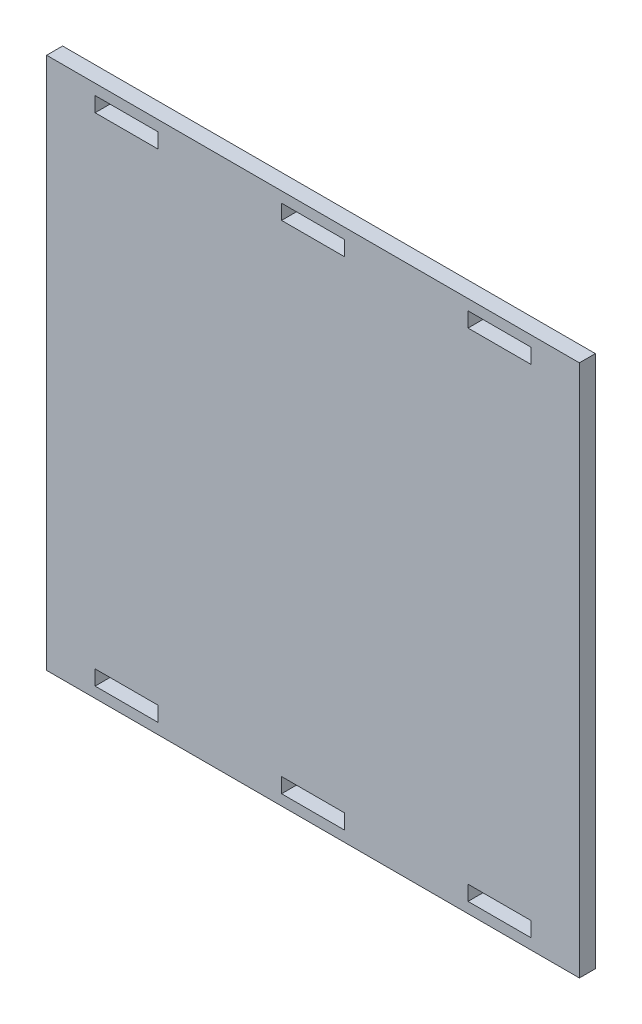
ISO-10303-21;
HEADER;
FILE_DESCRIPTION(('STEP AP214'),'2;1');
FILE_NAME('part.step','',(''),(''),'','','');
FILE_SCHEMA(('AUTOMOTIVE_DESIGN { 1 0 10303 214 1 1 1 1 }'));
ENDSEC;
DATA;
#1=APPLICATION_CONTEXT('core data for automotive mechanical design processes');
#2=APPLICATION_PROTOCOL_DEFINITION('international standard','automotive_design',2000,#1);
#3=PRODUCT_CONTEXT('',#1,'mechanical');
#4=PRODUCT('Part','Part','',(#3));
#5=PRODUCT_RELATED_PRODUCT_CATEGORY('part','',(#4));
#6=PRODUCT_DEFINITION_FORMATION('','',#4);
#7=PRODUCT_DEFINITION_CONTEXT('part definition',#1,'design');
#8=PRODUCT_DEFINITION('design','',#6,#7);
#9=PRODUCT_DEFINITION_SHAPE('','',#8);
#10=(LENGTH_UNIT() NAMED_UNIT(*) SI_UNIT(.MILLI.,.METRE.));
#11=(NAMED_UNIT(*) PLANE_ANGLE_UNIT() SI_UNIT($,.RADIAN.));
#12=(NAMED_UNIT(*) SI_UNIT($,.STERADIAN.) SOLID_ANGLE_UNIT());
#13=UNCERTAINTY_MEASURE_WITH_UNIT(LENGTH_MEASURE(1.E-05),#10,'distance_accuracy_value','');
#14=(GEOMETRIC_REPRESENTATION_CONTEXT(3) GLOBAL_UNCERTAINTY_ASSIGNED_CONTEXT((#13)) GLOBAL_UNIT_ASSIGNED_CONTEXT((#10,
#11,#12)) REPRESENTATION_CONTEXT('',''));
#15=CARTESIAN_POINT('',(0.,0.,0.));
#16=DIRECTION('',(0.,0.,1.));
#17=DIRECTION('',(1.,0.,0.));
#18=AXIS2_PLACEMENT_3D('',#15,#16,#17);
#19=CARTESIAN_POINT('',(0.,0.,-3.));
#20=DIRECTION('',(-1.,0.,0.));
#21=DIRECTION('',(0.,0.,1.));
#22=AXIS2_PLACEMENT_3D('',#19,#20,#21);
#23=PLANE('',#22);
#24=DIRECTION('',(0.,-1.,0.));
#25=VECTOR('',#24,1.);
#26=CARTESIAN_POINT('',(0.,0.,0.));
#27=LINE('',#26,#25);
#28=CARTESIAN_POINT('',(0.,100.,0.));
#29=VERTEX_POINT('',#28);
#30=CARTESIAN_POINT('',(0.,0.,0.));
#31=VERTEX_POINT('',#30);
#32=EDGE_CURVE('E410',#29,#31,#27,.T.);
#33=ORIENTED_EDGE('',*,*,#32,.F.);
#34=DIRECTION('',(0.,0.,1.));
#35=VECTOR('',#34,1.);
#36=CARTESIAN_POINT('',(0.,100.,-3.));
#37=LINE('',#36,#35);
#38=CARTESIAN_POINT('',(0.,100.,-3.));
#39=VERTEX_POINT('',#38);
#40=EDGE_CURVE('E11',#39,#29,#37,.T.);
#41=ORIENTED_EDGE('',*,*,#40,.F.);
#42=DIRECTION('',(0.,-1.,0.));
#43=VECTOR('',#42,1.);
#44=CARTESIAN_POINT('',(0.,0.,-3.));
#45=LINE('',#44,#43);
#46=CARTESIAN_POINT('',(0.,0.,-3.));
#47=VERTEX_POINT('',#46);
#48=EDGE_CURVE('E417',#39,#47,#45,.T.);
#49=ORIENTED_EDGE('',*,*,#48,.T.);
#50=DIRECTION('',(0.,0.,1.));
#51=VECTOR('',#50,1.);
#52=CARTESIAN_POINT('',(0.,0.,-3.));
#53=LINE('',#52,#51);
#54=EDGE_CURVE('E38',#47,#31,#53,.T.);
#55=ORIENTED_EDGE('',*,*,#54,.T.);
#56=EDGE_LOOP('',(#33,#41,#49,#55));
#57=FACE_BOUND('',#56,.T.);
#58=ADVANCED_FACE('F35',(#57),#23,.T.);
#59=CARTESIAN_POINT('',(0.,100.,-3.));
#60=DIRECTION('',(0.,1.,0.));
#61=DIRECTION('',(0.,0.,1.));
#62=AXIS2_PLACEMENT_3D('',#59,#60,#61);
#63=PLANE('',#62);
#64=DIRECTION('',(-1.,0.,0.));
#65=VECTOR('',#64,1.);
#66=CARTESIAN_POINT('',(0.,100.,0.));
#67=LINE('',#66,#65);
#68=CARTESIAN_POINT('',(100.,100.,0.));
#69=VERTEX_POINT('',#68);
#70=EDGE_CURVE('E421',#69,#29,#67,.T.);
#71=ORIENTED_EDGE('',*,*,#70,.F.);
#72=DIRECTION('',(0.,0.,1.));
#73=VECTOR('',#72,1.);
#74=CARTESIAN_POINT('',(100.,100.,-3.));
#75=LINE('',#74,#73);
#76=CARTESIAN_POINT('',(100.,100.,-3.));
#77=VERTEX_POINT('',#76);
#78=EDGE_CURVE('E43',#77,#69,#75,.T.);
#79=ORIENTED_EDGE('',*,*,#78,.F.);
#80=DIRECTION('',(-1.,0.,0.));
#81=VECTOR('',#80,1.);
#82=CARTESIAN_POINT('',(0.,100.,-3.));
#83=LINE('',#82,#81);
#84=EDGE_CURVE('E427',#77,#39,#83,.T.);
#85=ORIENTED_EDGE('',*,*,#84,.T.);
#86=ORIENTED_EDGE('',*,*,#40,.T.);
#87=EDGE_LOOP('',(#71,#79,#85,#86));
#88=FACE_BOUND('',#87,.T.);
#89=ADVANCED_FACE('F453',(#88),#63,.T.);
#90=CARTESIAN_POINT('',(100.,0.,-3.));
#91=DIRECTION('',(1.,0.,0.));
#92=DIRECTION('',(0.,0.,-1.));
#93=AXIS2_PLACEMENT_3D('',#90,#91,#92);
#94=PLANE('',#93);
#95=DIRECTION('',(0.,1.,0.));
#96=VECTOR('',#95,1.);
#97=CARTESIAN_POINT('',(100.,0.,0.));
#98=LINE('',#97,#96);
#99=CARTESIAN_POINT('',(100.,0.,0.));
#100=VERTEX_POINT('',#99);
#101=EDGE_CURVE('E435',#100,#69,#98,.T.);
#102=ORIENTED_EDGE('',*,*,#101,.F.);
#103=DIRECTION('',(0.,0.,1.));
#104=VECTOR('',#103,1.);
#105=CARTESIAN_POINT('',(100.,0.,-3.));
#106=LINE('',#105,#104);
#107=CARTESIAN_POINT('',(100.,0.,-3.));
#108=VERTEX_POINT('',#107);
#109=EDGE_CURVE('E440',#108,#100,#106,.T.);
#110=ORIENTED_EDGE('',*,*,#109,.F.);
#111=DIRECTION('',(0.,1.,0.));
#112=VECTOR('',#111,1.);
#113=CARTESIAN_POINT('',(100.,0.,-3.));
#114=LINE('',#113,#112);
#115=EDGE_CURVE('E424',#108,#77,#114,.T.);
#116=ORIENTED_EDGE('',*,*,#115,.T.);
#117=ORIENTED_EDGE('',*,*,#78,.T.);
#118=EDGE_LOOP('',(#102,#110,#116,#117));
#119=FACE_BOUND('',#118,.T.);
#120=ADVANCED_FACE('F458',(#119),#94,.T.);
#121=CARTESIAN_POINT('',(0.,0.,-3.));
#122=DIRECTION('',(0.,-1.,0.));
#123=DIRECTION('',(0.,0.,-1.));
#124=AXIS2_PLACEMENT_3D('',#121,#122,#123);
#125=PLANE('',#124);
#126=DIRECTION('',(1.,0.,0.));
#127=VECTOR('',#126,1.);
#128=CARTESIAN_POINT('',(0.,0.,0.));
#129=LINE('',#128,#127);
#130=EDGE_CURVE('E432',#31,#100,#129,.T.);
#131=ORIENTED_EDGE('',*,*,#130,.F.);
#132=ORIENTED_EDGE('',*,*,#54,.F.);
#133=DIRECTION('',(1.,0.,0.));
#134=VECTOR('',#133,1.);
#135=CARTESIAN_POINT('',(0.,0.,-3.));
#136=LINE('',#135,#134);
#137=EDGE_CURVE('E420',#47,#108,#136,.T.);
#138=ORIENTED_EDGE('',*,*,#137,.T.);
#139=ORIENTED_EDGE('',*,*,#109,.T.);
#140=EDGE_LOOP('',(#131,#132,#138,#139));
#141=FACE_BOUND('',#140,.T.);
#142=ADVANCED_FACE('F448',(#141),#125,.T.);
#143=CARTESIAN_POINT('',(0.,0.,-3.));
#144=DIRECTION('',(0.,0.,-1.));
#145=DIRECTION('',(-1.,0.,0.));
#146=AXIS2_PLACEMENT_3D('',#143,#144,#145);
#147=PLANE('',#146);
#148=DIRECTION('',(0.,-1.,0.));
#149=VECTOR('',#148,1.);
#150=CARTESIAN_POINT('',(9.1,95.2,-3.));
#151=LINE('',#150,#149);
#152=CARTESIAN_POINT('',(9.1,98.,-3.));
#153=VERTEX_POINT('',#152);
#154=CARTESIAN_POINT('',(9.1,95.2,-3.));
#155=VERTEX_POINT('',#154);
#156=EDGE_CURVE('E222',#153,#155,#151,.T.);
#157=ORIENTED_EDGE('',*,*,#156,.T.);
#158=DIRECTION('',(1.,0.,0.));
#159=VECTOR('',#158,1.);
#160=CARTESIAN_POINT('',(9.1,95.2,-3.));
#161=LINE('',#160,#159);
#162=CARTESIAN_POINT('',(20.9,95.2,-3.));
#163=VERTEX_POINT('',#162);
#164=EDGE_CURVE('E231',#155,#163,#161,.T.);
#165=ORIENTED_EDGE('',*,*,#164,.T.);
#166=DIRECTION('',(0.,1.,0.));
#167=VECTOR('',#166,1.);
#168=CARTESIAN_POINT('',(20.9,95.2,-3.));
#169=LINE('',#168,#167);
#170=CARTESIAN_POINT('',(20.9,98.,-3.));
#171=VERTEX_POINT('',#170);
#172=EDGE_CURVE('E51',#163,#171,#169,.T.);
#173=ORIENTED_EDGE('',*,*,#172,.T.);
#174=DIRECTION('',(-1.,0.,0.));
#175=VECTOR('',#174,1.);
#176=CARTESIAN_POINT('',(9.1,98.,-3.));
#177=LINE('',#176,#175);
#178=EDGE_CURVE('E228',#171,#153,#177,.T.);
#179=ORIENTED_EDGE('',*,*,#178,.T.);
#180=EDGE_LOOP('',(#157,#165,#173,#179));
#181=FACE_BOUND('',#180,.T.);
#182=DIRECTION('',(0.,-1.,0.));
#183=VECTOR('',#182,1.);
#184=CARTESIAN_POINT('',(44.1,95.2,-3.));
#185=LINE('',#184,#183);
#186=CARTESIAN_POINT('',(44.1,98.,-3.));
#187=VERTEX_POINT('',#186);
#188=CARTESIAN_POINT('',(44.1,95.2,-3.));
#189=VERTEX_POINT('',#188);
#190=EDGE_CURVE('E257',#187,#189,#185,.T.);
#191=ORIENTED_EDGE('',*,*,#190,.T.);
#192=DIRECTION('',(1.,0.,0.));
#193=VECTOR('',#192,1.);
#194=CARTESIAN_POINT('',(44.1,95.2,-3.));
#195=LINE('',#194,#193);
#196=CARTESIAN_POINT('',(55.9,95.2,-3.));
#197=VERTEX_POINT('',#196);
#198=EDGE_CURVE('E260',#189,#197,#195,.T.);
#199=ORIENTED_EDGE('',*,*,#198,.T.);
#200=DIRECTION('',(0.,1.,0.));
#201=VECTOR('',#200,1.);
#202=CARTESIAN_POINT('',(55.9,95.2,-3.));
#203=LINE('',#202,#201);
#204=CARTESIAN_POINT('',(55.9,98.,-3.));
#205=VERTEX_POINT('',#204);
#206=EDGE_CURVE('E264',#197,#205,#203,.T.);
#207=ORIENTED_EDGE('',*,*,#206,.T.);
#208=DIRECTION('',(-1.,0.,0.));
#209=VECTOR('',#208,1.);
#210=CARTESIAN_POINT('',(44.1,98.,-3.));
#211=LINE('',#210,#209);
#212=EDGE_CURVE('E267',#205,#187,#211,.T.);
#213=ORIENTED_EDGE('',*,*,#212,.T.);
#214=EDGE_LOOP('',(#191,#199,#207,#213));
#215=FACE_BOUND('',#214,.T.);
#216=DIRECTION('',(1.,0.,0.));
#217=VECTOR('',#216,1.);
#218=CARTESIAN_POINT('',(79.1,2.,-3.));
#219=LINE('',#218,#217);
#220=CARTESIAN_POINT('',(79.1,2.,-3.));
#221=VERTEX_POINT('',#220);
#222=CARTESIAN_POINT('',(90.9,2.,-3.));
#223=VERTEX_POINT('',#222);
#224=EDGE_CURVE('E289',#221,#223,#219,.T.);
#225=ORIENTED_EDGE('',*,*,#224,.T.);
#226=DIRECTION('',(0.,1.,0.));
#227=VECTOR('',#226,1.);
#228=CARTESIAN_POINT('',(90.9,4.8,-3.));
#229=LINE('',#228,#227);
#230=CARTESIAN_POINT('',(90.9,4.8,-3.));
#231=VERTEX_POINT('',#230);
#232=EDGE_CURVE('E292',#223,#231,#229,.T.);
#233=ORIENTED_EDGE('',*,*,#232,.T.);
#234=DIRECTION('',(-1.,0.,0.));
#235=VECTOR('',#234,1.);
#236=CARTESIAN_POINT('',(79.1,4.8,-3.));
#237=LINE('',#236,#235);
#238=CARTESIAN_POINT('',(79.1,4.8,-3.));
#239=VERTEX_POINT('',#238);
#240=EDGE_CURVE('E296',#231,#239,#237,.T.);
#241=ORIENTED_EDGE('',*,*,#240,.T.);
#242=DIRECTION('',(0.,-1.,0.));
#243=VECTOR('',#242,1.);
#244=CARTESIAN_POINT('',(79.1,4.8,-3.));
#245=LINE('',#244,#243);
#246=EDGE_CURVE('E299',#239,#221,#245,.T.);
#247=ORIENTED_EDGE('',*,*,#246,.T.);
#248=EDGE_LOOP('',(#225,#233,#241,#247));
#249=FACE_BOUND('',#248,.T.);
#250=DIRECTION('',(1.,0.,0.));
#251=VECTOR('',#250,1.);
#252=CARTESIAN_POINT('',(44.1,2.,-3.));
#253=LINE('',#252,#251);
#254=CARTESIAN_POINT('',(44.1,2.,-3.));
#255=VERTEX_POINT('',#254);
#256=CARTESIAN_POINT('',(55.9,2.,-3.));
#257=VERTEX_POINT('',#256);
#258=EDGE_CURVE('E321',#255,#257,#253,.T.);
#259=ORIENTED_EDGE('',*,*,#258,.T.);
#260=DIRECTION('',(0.,1.,0.));
#261=VECTOR('',#260,1.);
#262=CARTESIAN_POINT('',(55.9,4.8,-3.));
#263=LINE('',#262,#261);
#264=CARTESIAN_POINT('',(55.9,4.8,-3.));
#265=VERTEX_POINT('',#264);
#266=EDGE_CURVE('E324',#257,#265,#263,.T.);
#267=ORIENTED_EDGE('',*,*,#266,.T.);
#268=DIRECTION('',(-1.,0.,0.));
#269=VECTOR('',#268,1.);
#270=CARTESIAN_POINT('',(44.1,4.8,-3.));
#271=LINE('',#270,#269);
#272=CARTESIAN_POINT('',(44.1,4.8,-3.));
#273=VERTEX_POINT('',#272);
#274=EDGE_CURVE('E328',#265,#273,#271,.T.);
#275=ORIENTED_EDGE('',*,*,#274,.T.);
#276=DIRECTION('',(0.,-1.,0.));
#277=VECTOR('',#276,1.);
#278=CARTESIAN_POINT('',(44.1,4.8,-3.));
#279=LINE('',#278,#277);
#280=EDGE_CURVE('E331',#273,#255,#279,.T.);
#281=ORIENTED_EDGE('',*,*,#280,.T.);
#282=EDGE_LOOP('',(#259,#267,#275,#281));
#283=FACE_BOUND('',#282,.T.);
#284=DIRECTION('',(0.,-1.,0.));
#285=VECTOR('',#284,1.);
#286=CARTESIAN_POINT('',(79.1,95.2,-3.));
#287=LINE('',#286,#285);
#288=CARTESIAN_POINT('',(79.1,98.,-3.));
#289=VERTEX_POINT('',#288);
#290=CARTESIAN_POINT('',(79.1,95.2,-3.));
#291=VERTEX_POINT('',#290);
#292=EDGE_CURVE('E353',#289,#291,#287,.T.);
#293=ORIENTED_EDGE('',*,*,#292,.T.);
#294=DIRECTION('',(1.,0.,0.));
#295=VECTOR('',#294,1.);
#296=CARTESIAN_POINT('',(79.1,95.2,-3.));
#297=LINE('',#296,#295);
#298=CARTESIAN_POINT('',(90.9,95.2,-3.));
#299=VERTEX_POINT('',#298);
#300=EDGE_CURVE('E356',#291,#299,#297,.T.);
#301=ORIENTED_EDGE('',*,*,#300,.T.);
#302=DIRECTION('',(0.,1.,0.));
#303=VECTOR('',#302,1.);
#304=CARTESIAN_POINT('',(90.9,95.2,-3.));
#305=LINE('',#304,#303);
#306=CARTESIAN_POINT('',(90.9,98.,-3.));
#307=VERTEX_POINT('',#306);
#308=EDGE_CURVE('E360',#299,#307,#305,.T.);
#309=ORIENTED_EDGE('',*,*,#308,.T.);
#310=DIRECTION('',(-1.,0.,0.));
#311=VECTOR('',#310,1.);
#312=CARTESIAN_POINT('',(79.1,98.,-3.));
#313=LINE('',#312,#311);
#314=EDGE_CURVE('E363',#307,#289,#313,.T.);
#315=ORIENTED_EDGE('',*,*,#314,.T.);
#316=EDGE_LOOP('',(#293,#301,#309,#315));
#317=FACE_BOUND('',#316,.T.);
#318=DIRECTION('',(0.,1.,0.));
#319=VECTOR('',#318,1.);
#320=CARTESIAN_POINT('',(20.9,4.8,-3.));
#321=LINE('',#320,#319);
#322=CARTESIAN_POINT('',(20.9,2.,-3.));
#323=VERTEX_POINT('',#322);
#324=CARTESIAN_POINT('',(20.9,4.8,-3.));
#325=VERTEX_POINT('',#324);
#326=EDGE_CURVE('E385',#323,#325,#321,.T.);
#327=ORIENTED_EDGE('',*,*,#326,.T.);
#328=DIRECTION('',(-1.,0.,0.));
#329=VECTOR('',#328,1.);
#330=CARTESIAN_POINT('',(9.1,4.8,-3.));
#331=LINE('',#330,#329);
#332=CARTESIAN_POINT('',(9.1,4.8,-3.));
#333=VERTEX_POINT('',#332);
#334=EDGE_CURVE('E388',#325,#333,#331,.T.);
#335=ORIENTED_EDGE('',*,*,#334,.T.);
#336=DIRECTION('',(0.,-1.,0.));
#337=VECTOR('',#336,1.);
#338=CARTESIAN_POINT('',(9.1,4.8,-3.));
#339=LINE('',#338,#337);
#340=CARTESIAN_POINT('',(9.1,2.,-3.));
#341=VERTEX_POINT('',#340);
#342=EDGE_CURVE('E392',#333,#341,#339,.T.);
#343=ORIENTED_EDGE('',*,*,#342,.T.);
#344=DIRECTION('',(1.,0.,0.));
#345=VECTOR('',#344,1.);
#346=CARTESIAN_POINT('',(9.1,2.,-3.));
#347=LINE('',#346,#345);
#348=EDGE_CURVE('E395',#341,#323,#347,.T.);
#349=ORIENTED_EDGE('',*,*,#348,.T.);
#350=EDGE_LOOP('',(#327,#335,#343,#349));
#351=FACE_BOUND('',#350,.T.);
#352=ORIENTED_EDGE('',*,*,#48,.F.);
#353=ORIENTED_EDGE('',*,*,#84,.F.);
#354=ORIENTED_EDGE('',*,*,#115,.F.);
#355=ORIENTED_EDGE('',*,*,#137,.F.);
#356=EDGE_LOOP('',(#352,#353,#354,#355));
#357=FACE_BOUND('',#356,.T.);
#358=ADVANCED_FACE('F235',(#181,#215,#249,#283,#317,#351,#357),#147,.T.);
#359=CARTESIAN_POINT('',(0.,0.,0.));
#360=DIRECTION('',(0.,0.,-1.));
#361=DIRECTION('',(-1.,0.,0.));
#362=AXIS2_PLACEMENT_3D('',#359,#360,#361);
#363=PLANE('',#362);
#364=DIRECTION('',(1.,0.,0.));
#365=VECTOR('',#364,1.);
#366=CARTESIAN_POINT('',(9.1,95.2,0.));
#367=LINE('',#366,#365);
#368=CARTESIAN_POINT('',(9.1,95.2,0.));
#369=VERTEX_POINT('',#368);
#370=CARTESIAN_POINT('',(20.9,95.2,0.));
#371=VERTEX_POINT('',#370);
#372=EDGE_CURVE('E247',#369,#371,#367,.T.);
#373=ORIENTED_EDGE('',*,*,#372,.F.);
#374=DIRECTION('',(0.,-1.,0.));
#375=VECTOR('',#374,1.);
#376=CARTESIAN_POINT('',(9.1,95.2,0.));
#377=LINE('',#376,#375);
#378=CARTESIAN_POINT('',(9.1,98.,0.));
#379=VERTEX_POINT('',#378);
#380=EDGE_CURVE('E59',#379,#369,#377,.T.);
#381=ORIENTED_EDGE('',*,*,#380,.F.);
#382=DIRECTION('',(-1.,0.,0.));
#383=VECTOR('',#382,1.);
#384=CARTESIAN_POINT('',(9.1,98.,0.));
#385=LINE('',#384,#383);
#386=CARTESIAN_POINT('',(20.9,98.,0.));
#387=VERTEX_POINT('',#386);
#388=EDGE_CURVE('E238',#387,#379,#385,.T.);
#389=ORIENTED_EDGE('',*,*,#388,.F.);
#390=DIRECTION('',(0.,1.,0.));
#391=VECTOR('',#390,1.);
#392=CARTESIAN_POINT('',(20.9,95.2,0.));
#393=LINE('',#392,#391);
#394=EDGE_CURVE('E241',#371,#387,#393,.T.);
#395=ORIENTED_EDGE('',*,*,#394,.F.);
#396=EDGE_LOOP('',(#373,#381,#389,#395));
#397=FACE_BOUND('',#396,.T.);
#398=DIRECTION('',(1.,0.,0.));
#399=VECTOR('',#398,1.);
#400=CARTESIAN_POINT('',(44.1,95.2,0.));
#401=LINE('',#400,#399);
#402=CARTESIAN_POINT('',(44.1,95.2,0.));
#403=VERTEX_POINT('',#402);
#404=CARTESIAN_POINT('',(55.9,95.2,0.));
#405=VERTEX_POINT('',#404);
#406=EDGE_CURVE('E272',#403,#405,#401,.T.);
#407=ORIENTED_EDGE('',*,*,#406,.F.);
#408=DIRECTION('',(0.,-1.,0.));
#409=VECTOR('',#408,1.);
#410=CARTESIAN_POINT('',(44.1,95.2,0.));
#411=LINE('',#410,#409);
#412=CARTESIAN_POINT('',(44.1,98.,0.));
#413=VERTEX_POINT('',#412);
#414=EDGE_CURVE('E253',#413,#403,#411,.T.);
#415=ORIENTED_EDGE('',*,*,#414,.F.);
#416=DIRECTION('',(-1.,0.,0.));
#417=VECTOR('',#416,1.);
#418=CARTESIAN_POINT('',(44.1,98.,0.));
#419=LINE('',#418,#417);
#420=CARTESIAN_POINT('',(55.9,98.,0.));
#421=VERTEX_POINT('',#420);
#422=EDGE_CURVE('E261',#421,#413,#419,.T.);
#423=ORIENTED_EDGE('',*,*,#422,.F.);
#424=DIRECTION('',(0.,1.,0.));
#425=VECTOR('',#424,1.);
#426=CARTESIAN_POINT('',(55.9,95.2,0.));
#427=LINE('',#426,#425);
#428=EDGE_CURVE('E275',#405,#421,#427,.T.);
#429=ORIENTED_EDGE('',*,*,#428,.F.);
#430=EDGE_LOOP('',(#407,#415,#423,#429));
#431=FACE_BOUND('',#430,.T.);
#432=DIRECTION('',(0.,1.,0.));
#433=VECTOR('',#432,1.);
#434=CARTESIAN_POINT('',(90.9,4.8,0.));
#435=LINE('',#434,#433);
#436=CARTESIAN_POINT('',(90.9,2.,0.));
#437=VERTEX_POINT('',#436);
#438=CARTESIAN_POINT('',(90.9,4.8,0.));
#439=VERTEX_POINT('',#438);
#440=EDGE_CURVE('E304',#437,#439,#435,.T.);
#441=ORIENTED_EDGE('',*,*,#440,.F.);
#442=DIRECTION('',(1.,0.,0.));
#443=VECTOR('',#442,1.);
#444=CARTESIAN_POINT('',(79.1,2.,0.));
#445=LINE('',#444,#443);
#446=CARTESIAN_POINT('',(79.1,2.,0.));
#447=VERTEX_POINT('',#446);
#448=EDGE_CURVE('E282',#447,#437,#445,.T.);
#449=ORIENTED_EDGE('',*,*,#448,.F.);
#450=DIRECTION('',(0.,-1.,0.));
#451=VECTOR('',#450,1.);
#452=CARTESIAN_POINT('',(79.1,4.8,0.));
#453=LINE('',#452,#451);
#454=CARTESIAN_POINT('',(79.1,4.8,0.));
#455=VERTEX_POINT('',#454);
#456=EDGE_CURVE('E293',#455,#447,#453,.T.);
#457=ORIENTED_EDGE('',*,*,#456,.F.);
#458=DIRECTION('',(-1.,0.,0.));
#459=VECTOR('',#458,1.);
#460=CARTESIAN_POINT('',(79.1,4.8,0.));
#461=LINE('',#460,#459);
#462=EDGE_CURVE('E307',#439,#455,#461,.T.);
#463=ORIENTED_EDGE('',*,*,#462,.F.);
#464=EDGE_LOOP('',(#441,#449,#457,#463));
#465=FACE_BOUND('',#464,.T.);
#466=DIRECTION('',(0.,1.,0.));
#467=VECTOR('',#466,1.);
#468=CARTESIAN_POINT('',(55.9,4.8,0.));
#469=LINE('',#468,#467);
#470=CARTESIAN_POINT('',(55.9,2.,0.));
#471=VERTEX_POINT('',#470);
#472=CARTESIAN_POINT('',(55.9,4.8,0.));
#473=VERTEX_POINT('',#472);
#474=EDGE_CURVE('E336',#471,#473,#469,.T.);
#475=ORIENTED_EDGE('',*,*,#474,.F.);
#476=DIRECTION('',(1.,0.,0.));
#477=VECTOR('',#476,1.);
#478=CARTESIAN_POINT('',(44.1,2.,0.));
#479=LINE('',#478,#477);
#480=CARTESIAN_POINT('',(44.1,2.,0.));
#481=VERTEX_POINT('',#480);
#482=EDGE_CURVE('E314',#481,#471,#479,.T.);
#483=ORIENTED_EDGE('',*,*,#482,.F.);
#484=DIRECTION('',(0.,-1.,0.));
#485=VECTOR('',#484,1.);
#486=CARTESIAN_POINT('',(44.1,4.8,0.));
#487=LINE('',#486,#485);
#488=CARTESIAN_POINT('',(44.1,4.8,0.));
#489=VERTEX_POINT('',#488);
#490=EDGE_CURVE('E325',#489,#481,#487,.T.);
#491=ORIENTED_EDGE('',*,*,#490,.F.);
#492=DIRECTION('',(-1.,0.,0.));
#493=VECTOR('',#492,1.);
#494=CARTESIAN_POINT('',(44.1,4.8,0.));
#495=LINE('',#494,#493);
#496=EDGE_CURVE('E339',#473,#489,#495,.T.);
#497=ORIENTED_EDGE('',*,*,#496,.F.);
#498=EDGE_LOOP('',(#475,#483,#491,#497));
#499=FACE_BOUND('',#498,.T.);
#500=DIRECTION('',(1.,0.,0.));
#501=VECTOR('',#500,1.);
#502=CARTESIAN_POINT('',(79.1,95.2,0.));
#503=LINE('',#502,#501);
#504=CARTESIAN_POINT('',(79.1,95.2,0.));
#505=VERTEX_POINT('',#504);
#506=CARTESIAN_POINT('',(90.9,95.2,0.));
#507=VERTEX_POINT('',#506);
#508=EDGE_CURVE('E368',#505,#507,#503,.T.);
#509=ORIENTED_EDGE('',*,*,#508,.F.);
#510=DIRECTION('',(0.,-1.,0.));
#511=VECTOR('',#510,1.);
#512=CARTESIAN_POINT('',(79.1,95.2,0.));
#513=LINE('',#512,#511);
#514=CARTESIAN_POINT('',(79.1,98.,0.));
#515=VERTEX_POINT('',#514);
#516=EDGE_CURVE('E346',#515,#505,#513,.T.);
#517=ORIENTED_EDGE('',*,*,#516,.F.);
#518=DIRECTION('',(-1.,0.,0.));
#519=VECTOR('',#518,1.);
#520=CARTESIAN_POINT('',(79.1,98.,0.));
#521=LINE('',#520,#519);
#522=CARTESIAN_POINT('',(90.9,98.,0.));
#523=VERTEX_POINT('',#522);
#524=EDGE_CURVE('E357',#523,#515,#521,.T.);
#525=ORIENTED_EDGE('',*,*,#524,.F.);
#526=DIRECTION('',(0.,1.,0.));
#527=VECTOR('',#526,1.);
#528=CARTESIAN_POINT('',(90.9,95.2,0.));
#529=LINE('',#528,#527);
#530=EDGE_CURVE('E371',#507,#523,#529,.T.);
#531=ORIENTED_EDGE('',*,*,#530,.F.);
#532=EDGE_LOOP('',(#509,#517,#525,#531));
#533=FACE_BOUND('',#532,.T.);
#534=DIRECTION('',(-1.,0.,0.));
#535=VECTOR('',#534,1.);
#536=CARTESIAN_POINT('',(9.1,4.8,0.));
#537=LINE('',#536,#535);
#538=CARTESIAN_POINT('',(20.9,4.8,0.));
#539=VERTEX_POINT('',#538);
#540=CARTESIAN_POINT('',(9.1,4.8,0.));
#541=VERTEX_POINT('',#540);
#542=EDGE_CURVE('E400',#539,#541,#537,.T.);
#543=ORIENTED_EDGE('',*,*,#542,.F.);
#544=DIRECTION('',(0.,1.,0.));
#545=VECTOR('',#544,1.);
#546=CARTESIAN_POINT('',(20.9,4.8,0.));
#547=LINE('',#546,#545);
#548=CARTESIAN_POINT('',(20.9,2.,0.));
#549=VERTEX_POINT('',#548);
#550=EDGE_CURVE('E378',#549,#539,#547,.T.);
#551=ORIENTED_EDGE('',*,*,#550,.F.);
#552=DIRECTION('',(1.,0.,0.));
#553=VECTOR('',#552,1.);
#554=CARTESIAN_POINT('',(9.1,2.,0.));
#555=LINE('',#554,#553);
#556=CARTESIAN_POINT('',(9.1,2.,0.));
#557=VERTEX_POINT('',#556);
#558=EDGE_CURVE('E389',#557,#549,#555,.T.);
#559=ORIENTED_EDGE('',*,*,#558,.F.);
#560=DIRECTION('',(0.,-1.,0.));
#561=VECTOR('',#560,1.);
#562=CARTESIAN_POINT('',(9.1,4.8,0.));
#563=LINE('',#562,#561);
#564=EDGE_CURVE('E403',#541,#557,#563,.T.);
#565=ORIENTED_EDGE('',*,*,#564,.F.);
#566=EDGE_LOOP('',(#543,#551,#559,#565));
#567=FACE_BOUND('',#566,.T.);
#568=ORIENTED_EDGE('',*,*,#32,.T.);
#569=ORIENTED_EDGE('',*,*,#130,.T.);
#570=ORIENTED_EDGE('',*,*,#101,.T.);
#571=ORIENTED_EDGE('',*,*,#70,.T.);
#572=EDGE_LOOP('',(#568,#569,#570,#571));
#573=FACE_BOUND('',#572,.T.);
#574=ADVANCED_FACE('F450',(#397,#431,#465,#499,#533,#567,#573),#363,.F.);
#575=CARTESIAN_POINT('',(20.9,4.8,-3.));
#576=DIRECTION('',(1.,0.,0.));
#577=DIRECTION('',(0.,0.,-1.));
#578=AXIS2_PLACEMENT_3D('',#575,#576,#577);
#579=PLANE('',#578);
#580=ORIENTED_EDGE('',*,*,#550,.T.);
#581=DIRECTION('',(0.,0.,1.));
#582=VECTOR('',#581,1.);
#583=CARTESIAN_POINT('',(20.9,4.8,-3.));
#584=LINE('',#583,#582);
#585=EDGE_CURVE('E398',#325,#539,#584,.T.);
#586=ORIENTED_EDGE('',*,*,#585,.F.);
#587=ORIENTED_EDGE('',*,*,#326,.F.);
#588=DIRECTION('',(0.,0.,1.));
#589=VECTOR('',#588,1.);
#590=CARTESIAN_POINT('',(20.9,2.,-3.));
#591=LINE('',#590,#589);
#592=EDGE_CURVE('E408',#323,#549,#591,.T.);
#593=ORIENTED_EDGE('',*,*,#592,.T.);
#594=EDGE_LOOP('',(#580,#586,#587,#593));
#595=FACE_BOUND('',#594,.T.);
#596=ADVANCED_FACE('F500',(#595),#579,.F.);
#597=CARTESIAN_POINT('',(9.1,2.,-3.));
#598=DIRECTION('',(0.,-1.,0.));
#599=DIRECTION('',(0.,0.,-1.));
#600=AXIS2_PLACEMENT_3D('',#597,#598,#599);
#601=PLANE('',#600);
#602=ORIENTED_EDGE('',*,*,#558,.T.);
#603=ORIENTED_EDGE('',*,*,#592,.F.);
#604=ORIENTED_EDGE('',*,*,#348,.F.);
#605=DIRECTION('',(0.,0.,1.));
#606=VECTOR('',#605,1.);
#607=CARTESIAN_POINT('',(9.1,2.,-3.));
#608=LINE('',#607,#606);
#609=EDGE_CURVE('E411',#341,#557,#608,.T.);
#610=ORIENTED_EDGE('',*,*,#609,.T.);
#611=EDGE_LOOP('',(#602,#603,#604,#610));
#612=FACE_BOUND('',#611,.T.);
#613=ADVANCED_FACE('F510',(#612),#601,.F.);
#614=CARTESIAN_POINT('',(9.1,4.8,-3.));
#615=DIRECTION('',(-1.,0.,0.));
#616=DIRECTION('',(0.,0.,1.));
#617=AXIS2_PLACEMENT_3D('',#614,#615,#616);
#618=PLANE('',#617);
#619=ORIENTED_EDGE('',*,*,#564,.T.);
#620=ORIENTED_EDGE('',*,*,#609,.F.);
#621=ORIENTED_EDGE('',*,*,#342,.F.);
#622=DIRECTION('',(0.,0.,1.));
#623=VECTOR('',#622,1.);
#624=CARTESIAN_POINT('',(9.1,4.8,-3.));
#625=LINE('',#624,#623);
#626=EDGE_CURVE('E413',#333,#541,#625,.T.);
#627=ORIENTED_EDGE('',*,*,#626,.T.);
#628=EDGE_LOOP('',(#619,#620,#621,#627));
#629=FACE_BOUND('',#628,.T.);
#630=ADVANCED_FACE('F520',(#629),#618,.F.);
#631=CARTESIAN_POINT('',(9.1,4.8,-3.));
#632=DIRECTION('',(0.,1.,0.));
#633=DIRECTION('',(0.,0.,1.));
#634=AXIS2_PLACEMENT_3D('',#631,#632,#633);
#635=PLANE('',#634);
#636=ORIENTED_EDGE('',*,*,#542,.T.);
#637=ORIENTED_EDGE('',*,*,#626,.F.);
#638=ORIENTED_EDGE('',*,*,#334,.F.);
#639=ORIENTED_EDGE('',*,*,#585,.T.);
#640=EDGE_LOOP('',(#636,#637,#638,#639));
#641=FACE_BOUND('',#640,.T.);
#642=ADVANCED_FACE('F530',(#641),#635,.F.);
#643=CARTESIAN_POINT('',(79.1,95.2,-3.));
#644=DIRECTION('',(-1.,0.,0.));
#645=DIRECTION('',(0.,0.,1.));
#646=AXIS2_PLACEMENT_3D('',#643,#644,#645);
#647=PLANE('',#646);
#648=ORIENTED_EDGE('',*,*,#516,.T.);
#649=DIRECTION('',(0.,0.,1.));
#650=VECTOR('',#649,1.);
#651=CARTESIAN_POINT('',(79.1,95.2,-3.));
#652=LINE('',#651,#650);
#653=EDGE_CURVE('E366',#291,#505,#652,.T.);
#654=ORIENTED_EDGE('',*,*,#653,.F.);
#655=ORIENTED_EDGE('',*,*,#292,.F.);
#656=DIRECTION('',(0.,0.,1.));
#657=VECTOR('',#656,1.);
#658=CARTESIAN_POINT('',(79.1,98.,-3.));
#659=LINE('',#658,#657);
#660=EDGE_CURVE('E376',#289,#515,#659,.T.);
#661=ORIENTED_EDGE('',*,*,#660,.T.);
#662=EDGE_LOOP('',(#648,#654,#655,#661));
#663=FACE_BOUND('',#662,.T.);
#664=ADVANCED_FACE('F540',(#663),#647,.F.);
#665=CARTESIAN_POINT('',(79.1,98.,-3.));
#666=DIRECTION('',(0.,1.,0.));
#667=DIRECTION('',(0.,0.,1.));
#668=AXIS2_PLACEMENT_3D('',#665,#666,#667);
#669=PLANE('',#668);
#670=ORIENTED_EDGE('',*,*,#524,.T.);
#671=ORIENTED_EDGE('',*,*,#660,.F.);
#672=ORIENTED_EDGE('',*,*,#314,.F.);
#673=DIRECTION('',(0.,0.,1.));
#674=VECTOR('',#673,1.);
#675=CARTESIAN_POINT('',(90.9,98.,-3.));
#676=LINE('',#675,#674);
#677=EDGE_CURVE('E379',#307,#523,#676,.T.);
#678=ORIENTED_EDGE('',*,*,#677,.T.);
#679=EDGE_LOOP('',(#670,#671,#672,#678));
#680=FACE_BOUND('',#679,.T.);
#681=ADVANCED_FACE('F550',(#680),#669,.F.);
#682=CARTESIAN_POINT('',(90.9,95.2,-3.));
#683=DIRECTION('',(1.,0.,0.));
#684=DIRECTION('',(0.,0.,-1.));
#685=AXIS2_PLACEMENT_3D('',#682,#683,#684);
#686=PLANE('',#685);
#687=ORIENTED_EDGE('',*,*,#530,.T.);
#688=ORIENTED_EDGE('',*,*,#677,.F.);
#689=ORIENTED_EDGE('',*,*,#308,.F.);
#690=DIRECTION('',(0.,0.,1.));
#691=VECTOR('',#690,1.);
#692=CARTESIAN_POINT('',(90.9,95.2,-3.));
#693=LINE('',#692,#691);
#694=EDGE_CURVE('E381',#299,#507,#693,.T.);
#695=ORIENTED_EDGE('',*,*,#694,.T.);
#696=EDGE_LOOP('',(#687,#688,#689,#695));
#697=FACE_BOUND('',#696,.T.);
#698=ADVANCED_FACE('F560',(#697),#686,.F.);
#699=CARTESIAN_POINT('',(79.1,95.2,-3.));
#700=DIRECTION('',(0.,-1.,0.));
#701=DIRECTION('',(0.,0.,-1.));
#702=AXIS2_PLACEMENT_3D('',#699,#700,#701);
#703=PLANE('',#702);
#704=ORIENTED_EDGE('',*,*,#508,.T.);
#705=ORIENTED_EDGE('',*,*,#694,.F.);
#706=ORIENTED_EDGE('',*,*,#300,.F.);
#707=ORIENTED_EDGE('',*,*,#653,.T.);
#708=EDGE_LOOP('',(#704,#705,#706,#707));
#709=FACE_BOUND('',#708,.T.);
#710=ADVANCED_FACE('F570',(#709),#703,.F.);
#711=CARTESIAN_POINT('',(44.1,2.,-3.));
#712=DIRECTION('',(0.,-1.,0.));
#713=DIRECTION('',(0.,0.,-1.));
#714=AXIS2_PLACEMENT_3D('',#711,#712,#713);
#715=PLANE('',#714);
#716=ORIENTED_EDGE('',*,*,#482,.T.);
#717=DIRECTION('',(0.,0.,1.));
#718=VECTOR('',#717,1.);
#719=CARTESIAN_POINT('',(55.9,2.,-3.));
#720=LINE('',#719,#718);
#721=EDGE_CURVE('E334',#257,#471,#720,.T.);
#722=ORIENTED_EDGE('',*,*,#721,.F.);
#723=ORIENTED_EDGE('',*,*,#258,.F.);
#724=DIRECTION('',(0.,0.,1.));
#725=VECTOR('',#724,1.);
#726=CARTESIAN_POINT('',(44.1,2.,-3.));
#727=LINE('',#726,#725);
#728=EDGE_CURVE('E344',#255,#481,#727,.T.);
#729=ORIENTED_EDGE('',*,*,#728,.T.);
#730=EDGE_LOOP('',(#716,#722,#723,#729));
#731=FACE_BOUND('',#730,.T.);
#732=ADVANCED_FACE('F580',(#731),#715,.F.);
#733=CARTESIAN_POINT('',(44.1,4.8,-3.));
#734=DIRECTION('',(-1.,0.,0.));
#735=DIRECTION('',(0.,0.,1.));
#736=AXIS2_PLACEMENT_3D('',#733,#734,#735);
#737=PLANE('',#736);
#738=ORIENTED_EDGE('',*,*,#490,.T.);
#739=ORIENTED_EDGE('',*,*,#728,.F.);
#740=ORIENTED_EDGE('',*,*,#280,.F.);
#741=DIRECTION('',(0.,0.,1.));
#742=VECTOR('',#741,1.);
#743=CARTESIAN_POINT('',(44.1,4.8,-3.));
#744=LINE('',#743,#742);
#745=EDGE_CURVE('E347',#273,#489,#744,.T.);
#746=ORIENTED_EDGE('',*,*,#745,.T.);
#747=EDGE_LOOP('',(#738,#739,#740,#746));
#748=FACE_BOUND('',#747,.T.);
#749=ADVANCED_FACE('F590',(#748),#737,.F.);
#750=CARTESIAN_POINT('',(44.1,4.8,-3.));
#751=DIRECTION('',(0.,1.,0.));
#752=DIRECTION('',(0.,0.,1.));
#753=AXIS2_PLACEMENT_3D('',#750,#751,#752);
#754=PLANE('',#753);
#755=ORIENTED_EDGE('',*,*,#496,.T.);
#756=ORIENTED_EDGE('',*,*,#745,.F.);
#757=ORIENTED_EDGE('',*,*,#274,.F.);
#758=DIRECTION('',(0.,0.,1.));
#759=VECTOR('',#758,1.);
#760=CARTESIAN_POINT('',(55.9,4.8,-3.));
#761=LINE('',#760,#759);
#762=EDGE_CURVE('E349',#265,#473,#761,.T.);
#763=ORIENTED_EDGE('',*,*,#762,.T.);
#764=EDGE_LOOP('',(#755,#756,#757,#763));
#765=FACE_BOUND('',#764,.T.);
#766=ADVANCED_FACE('F600',(#765),#754,.F.);
#767=CARTESIAN_POINT('',(55.9,4.8,-3.));
#768=DIRECTION('',(1.,0.,0.));
#769=DIRECTION('',(0.,0.,-1.));
#770=AXIS2_PLACEMENT_3D('',#767,#768,#769);
#771=PLANE('',#770);
#772=ORIENTED_EDGE('',*,*,#474,.T.);
#773=ORIENTED_EDGE('',*,*,#762,.F.);
#774=ORIENTED_EDGE('',*,*,#266,.F.);
#775=ORIENTED_EDGE('',*,*,#721,.T.);
#776=EDGE_LOOP('',(#772,#773,#774,#775));
#777=FACE_BOUND('',#776,.T.);
#778=ADVANCED_FACE('F610',(#777),#771,.F.);
#779=CARTESIAN_POINT('',(79.1,2.,-3.));
#780=DIRECTION('',(0.,-1.,0.));
#781=DIRECTION('',(1.,0.,0.));
#782=AXIS2_PLACEMENT_3D('',#779,#780,#781);
#783=PLANE('',#782);
#784=ORIENTED_EDGE('',*,*,#448,.T.);
#785=DIRECTION('',(0.,0.,1.));
#786=VECTOR('',#785,1.);
#787=CARTESIAN_POINT('',(90.9,2.,-3.));
#788=LINE('',#787,#786);
#789=EDGE_CURVE('E302',#223,#437,#788,.T.);
#790=ORIENTED_EDGE('',*,*,#789,.F.);
#791=ORIENTED_EDGE('',*,*,#224,.F.);
#792=DIRECTION('',(0.,0.,1.));
#793=VECTOR('',#792,1.);
#794=CARTESIAN_POINT('',(79.1,2.,-3.));
#795=LINE('',#794,#793);
#796=EDGE_CURVE('E312',#221,#447,#795,.T.);
#797=ORIENTED_EDGE('',*,*,#796,.T.);
#798=EDGE_LOOP('',(#784,#790,#791,#797));
#799=FACE_BOUND('',#798,.T.);
#800=ADVANCED_FACE('F620',(#799),#783,.F.);
#801=CARTESIAN_POINT('',(79.1,4.8,-3.));
#802=DIRECTION('',(-1.,0.,0.));
#803=DIRECTION('',(0.,0.,1.));
#804=AXIS2_PLACEMENT_3D('',#801,#802,#803);
#805=PLANE('',#804);
#806=ORIENTED_EDGE('',*,*,#456,.T.);
#807=ORIENTED_EDGE('',*,*,#796,.F.);
#808=ORIENTED_EDGE('',*,*,#246,.F.);
#809=DIRECTION('',(0.,0.,1.));
#810=VECTOR('',#809,1.);
#811=CARTESIAN_POINT('',(79.1,4.8,-3.));
#812=LINE('',#811,#810);
#813=EDGE_CURVE('E315',#239,#455,#812,.T.);
#814=ORIENTED_EDGE('',*,*,#813,.T.);
#815=EDGE_LOOP('',(#806,#807,#808,#814));
#816=FACE_BOUND('',#815,.T.);
#817=ADVANCED_FACE('F630',(#816),#805,.F.);
#818=CARTESIAN_POINT('',(79.1,4.8,-3.));
#819=DIRECTION('',(0.,1.,0.));
#820=DIRECTION('',(0.,0.,1.));
#821=AXIS2_PLACEMENT_3D('',#818,#819,#820);
#822=PLANE('',#821);
#823=ORIENTED_EDGE('',*,*,#462,.T.);
#824=ORIENTED_EDGE('',*,*,#813,.F.);
#825=ORIENTED_EDGE('',*,*,#240,.F.);
#826=DIRECTION('',(0.,0.,1.));
#827=VECTOR('',#826,1.);
#828=CARTESIAN_POINT('',(90.9,4.8,-3.));
#829=LINE('',#828,#827);
#830=EDGE_CURVE('E317',#231,#439,#829,.T.);
#831=ORIENTED_EDGE('',*,*,#830,.T.);
#832=EDGE_LOOP('',(#823,#824,#825,#831));
#833=FACE_BOUND('',#832,.T.);
#834=ADVANCED_FACE('F640',(#833),#822,.F.);
#835=CARTESIAN_POINT('',(90.9,4.8,-3.));
#836=DIRECTION('',(1.,0.,0.));
#837=DIRECTION('',(0.,0.,-1.));
#838=AXIS2_PLACEMENT_3D('',#835,#836,#837);
#839=PLANE('',#838);
#840=ORIENTED_EDGE('',*,*,#440,.T.);
#841=ORIENTED_EDGE('',*,*,#830,.F.);
#842=ORIENTED_EDGE('',*,*,#232,.F.);
#843=ORIENTED_EDGE('',*,*,#789,.T.);
#844=EDGE_LOOP('',(#840,#841,#842,#843));
#845=FACE_BOUND('',#844,.T.);
#846=ADVANCED_FACE('F650',(#845),#839,.F.);
#847=CARTESIAN_POINT('',(44.1,95.2,-3.));
#848=DIRECTION('',(-1.,0.,0.));
#849=DIRECTION('',(0.,0.,1.));
#850=AXIS2_PLACEMENT_3D('',#847,#848,#849);
#851=PLANE('',#850);
#852=ORIENTED_EDGE('',*,*,#414,.T.);
#853=DIRECTION('',(0.,0.,1.));
#854=VECTOR('',#853,1.);
#855=CARTESIAN_POINT('',(44.1,95.2,-3.));
#856=LINE('',#855,#854);
#857=EDGE_CURVE('E270',#189,#403,#856,.T.);
#858=ORIENTED_EDGE('',*,*,#857,.F.);
#859=ORIENTED_EDGE('',*,*,#190,.F.);
#860=DIRECTION('',(0.,0.,1.));
#861=VECTOR('',#860,1.);
#862=CARTESIAN_POINT('',(44.1,98.,-3.));
#863=LINE('',#862,#861);
#864=EDGE_CURVE('E280',#187,#413,#863,.T.);
#865=ORIENTED_EDGE('',*,*,#864,.T.);
#866=EDGE_LOOP('',(#852,#858,#859,#865));
#867=FACE_BOUND('',#866,.T.);
#868=ADVANCED_FACE('F660',(#867),#851,.F.);
#869=CARTESIAN_POINT('',(44.1,98.,-3.));
#870=DIRECTION('',(0.,1.,0.));
#871=DIRECTION('',(0.,0.,1.));
#872=AXIS2_PLACEMENT_3D('',#869,#870,#871);
#873=PLANE('',#872);
#874=ORIENTED_EDGE('',*,*,#422,.T.);
#875=ORIENTED_EDGE('',*,*,#864,.F.);
#876=ORIENTED_EDGE('',*,*,#212,.F.);
#877=DIRECTION('',(0.,0.,1.));
#878=VECTOR('',#877,1.);
#879=CARTESIAN_POINT('',(55.9,98.,-3.));
#880=LINE('',#879,#878);
#881=EDGE_CURVE('E283',#205,#421,#880,.T.);
#882=ORIENTED_EDGE('',*,*,#881,.T.);
#883=EDGE_LOOP('',(#874,#875,#876,#882));
#884=FACE_BOUND('',#883,.T.);
#885=ADVANCED_FACE('F670',(#884),#873,.F.);
#886=CARTESIAN_POINT('',(55.9,95.2,-3.));
#887=DIRECTION('',(1.,0.,0.));
#888=DIRECTION('',(0.,0.,-1.));
#889=AXIS2_PLACEMENT_3D('',#886,#887,#888);
#890=PLANE('',#889);
#891=ORIENTED_EDGE('',*,*,#428,.T.);
#892=ORIENTED_EDGE('',*,*,#881,.F.);
#893=ORIENTED_EDGE('',*,*,#206,.F.);
#894=DIRECTION('',(0.,0.,1.));
#895=VECTOR('',#894,1.);
#896=CARTESIAN_POINT('',(55.9,95.2,-3.));
#897=LINE('',#896,#895);
#898=EDGE_CURVE('E285',#197,#405,#897,.T.);
#899=ORIENTED_EDGE('',*,*,#898,.T.);
#900=EDGE_LOOP('',(#891,#892,#893,#899));
#901=FACE_BOUND('',#900,.T.);
#902=ADVANCED_FACE('F680',(#901),#890,.F.);
#903=CARTESIAN_POINT('',(44.1,95.2,-3.));
#904=DIRECTION('',(0.,-1.,0.));
#905=DIRECTION('',(0.,0.,-1.));
#906=AXIS2_PLACEMENT_3D('',#903,#904,#905);
#907=PLANE('',#906);
#908=ORIENTED_EDGE('',*,*,#406,.T.);
#909=ORIENTED_EDGE('',*,*,#898,.F.);
#910=ORIENTED_EDGE('',*,*,#198,.F.);
#911=ORIENTED_EDGE('',*,*,#857,.T.);
#912=EDGE_LOOP('',(#908,#909,#910,#911));
#913=FACE_BOUND('',#912,.T.);
#914=ADVANCED_FACE('F690',(#913),#907,.F.);
#915=CARTESIAN_POINT('',(9.1,95.2,-3.));
#916=DIRECTION('',(-1.,0.,0.));
#917=DIRECTION('',(0.,0.,1.));
#918=AXIS2_PLACEMENT_3D('',#915,#916,#917);
#919=PLANE('',#918);
#920=ORIENTED_EDGE('',*,*,#380,.T.);
#921=DIRECTION('',(0.,0.,1.));
#922=VECTOR('',#921,1.);
#923=CARTESIAN_POINT('',(9.1,95.2,-3.));
#924=LINE('',#923,#922);
#925=EDGE_CURVE('E218',#155,#369,#924,.T.);
#926=ORIENTED_EDGE('',*,*,#925,.F.);
#927=ORIENTED_EDGE('',*,*,#156,.F.);
#928=DIRECTION('',(0.,0.,1.));
#929=VECTOR('',#928,1.);
#930=CARTESIAN_POINT('',(9.1,98.,-3.));
#931=LINE('',#930,#929);
#932=EDGE_CURVE('E251',#153,#379,#931,.T.);
#933=ORIENTED_EDGE('',*,*,#932,.T.);
#934=EDGE_LOOP('',(#920,#926,#927,#933));
#935=FACE_BOUND('',#934,.T.);
#936=ADVANCED_FACE('F220',(#935),#919,.F.);
#937=CARTESIAN_POINT('',(9.1,98.,-3.));
#938=DIRECTION('',(0.,1.,0.));
#939=DIRECTION('',(0.,0.,1.));
#940=AXIS2_PLACEMENT_3D('',#937,#938,#939);
#941=PLANE('',#940);
#942=ORIENTED_EDGE('',*,*,#388,.T.);
#943=ORIENTED_EDGE('',*,*,#932,.F.);
#944=ORIENTED_EDGE('',*,*,#178,.F.);
#945=DIRECTION('',(0.,0.,1.));
#946=VECTOR('',#945,1.);
#947=CARTESIAN_POINT('',(20.9,98.,-3.));
#948=LINE('',#947,#946);
#949=EDGE_CURVE('E254',#171,#387,#948,.T.);
#950=ORIENTED_EDGE('',*,*,#949,.T.);
#951=EDGE_LOOP('',(#942,#943,#944,#950));
#952=FACE_BOUND('',#951,.T.);
#953=ADVANCED_FACE('F709',(#952),#941,.F.);
#954=CARTESIAN_POINT('',(20.9,95.2,-3.));
#955=DIRECTION('',(1.,0.,0.));
#956=DIRECTION('',(0.,0.,-1.));
#957=AXIS2_PLACEMENT_3D('',#954,#955,#956);
#958=PLANE('',#957);
#959=ORIENTED_EDGE('',*,*,#394,.T.);
#960=ORIENTED_EDGE('',*,*,#949,.F.);
#961=ORIENTED_EDGE('',*,*,#172,.F.);
#962=DIRECTION('',(0.,0.,1.));
#963=VECTOR('',#962,1.);
#964=CARTESIAN_POINT('',(20.9,95.2,-3.));
#965=LINE('',#964,#963);
#966=EDGE_CURVE('E227',#163,#371,#965,.T.);
#967=ORIENTED_EDGE('',*,*,#966,.T.);
#968=EDGE_LOOP('',(#959,#960,#961,#967));
#969=FACE_BOUND('',#968,.T.);
#970=ADVANCED_FACE('F718',(#969),#958,.F.);
#971=CARTESIAN_POINT('',(9.1,95.2,-3.));
#972=DIRECTION('',(0.,-1.,0.));
#973=DIRECTION('',(0.,0.,-1.));
#974=AXIS2_PLACEMENT_3D('',#971,#972,#973);
#975=PLANE('',#974);
#976=ORIENTED_EDGE('',*,*,#372,.T.);
#977=ORIENTED_EDGE('',*,*,#966,.F.);
#978=ORIENTED_EDGE('',*,*,#164,.F.);
#979=ORIENTED_EDGE('',*,*,#925,.T.);
#980=EDGE_LOOP('',(#976,#977,#978,#979));
#981=FACE_BOUND('',#980,.T.);
#982=ADVANCED_FACE('F232',(#981),#975,.F.);
#983=CLOSED_SHELL('',(#58,#89,#120,#142,#358,#574,#596,#613,#630,#642,#664,#681,#698,#710,#732,
#749,#766,#778,#800,#817,#834,#846,#868,#885,#902,#914,#936,#953,#970,#982));
#984=MANIFOLD_SOLID_BREP('B2',#983);
#985=ADVANCED_BREP_SHAPE_REPRESENTATION('',(#18,#984),#14);
#986=SHAPE_DEFINITION_REPRESENTATION(#9,#985);
ENDSEC;
END-ISO-10303-21;
